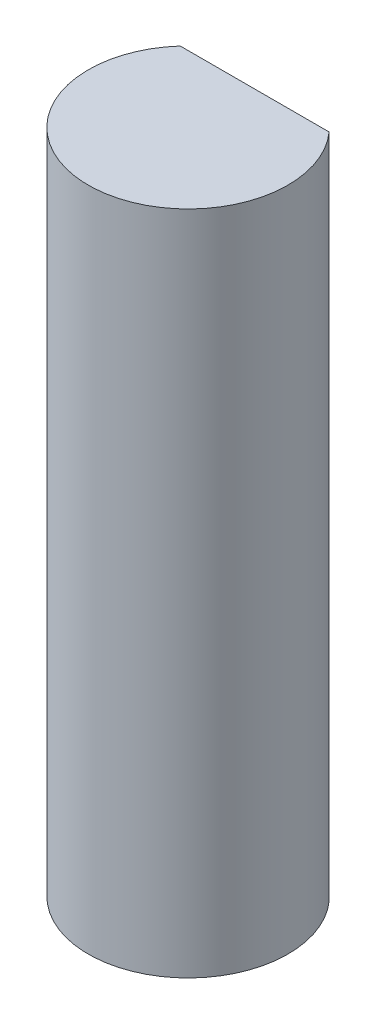
ISO-10303-21;
HEADER;
FILE_DESCRIPTION(('STEP AP214'),'2;1');
FILE_NAME('part.step','',(''),(''),'','','');
FILE_SCHEMA(('AUTOMOTIVE_DESIGN { 1 0 10303 214 1 1 1 1 }'));
ENDSEC;
DATA;
#1=APPLICATION_CONTEXT('core data for automotive mechanical design processes');
#2=APPLICATION_PROTOCOL_DEFINITION('international standard','automotive_design',2000,#1);
#3=PRODUCT_CONTEXT('',#1,'mechanical');
#4=PRODUCT('Part','Part','',(#3));
#5=PRODUCT_RELATED_PRODUCT_CATEGORY('part','',(#4));
#6=PRODUCT_DEFINITION_FORMATION('','',#4);
#7=PRODUCT_DEFINITION_CONTEXT('part definition',#1,'design');
#8=PRODUCT_DEFINITION('design','',#6,#7);
#9=PRODUCT_DEFINITION_SHAPE('','',#8);
#10=(LENGTH_UNIT() NAMED_UNIT(*) SI_UNIT(.MILLI.,.METRE.));
#11=(NAMED_UNIT(*) PLANE_ANGLE_UNIT() SI_UNIT($,.RADIAN.));
#12=(NAMED_UNIT(*) SI_UNIT($,.STERADIAN.) SOLID_ANGLE_UNIT());
#13=UNCERTAINTY_MEASURE_WITH_UNIT(LENGTH_MEASURE(1.E-05),#10,'distance_accuracy_value','');
#14=(GEOMETRIC_REPRESENTATION_CONTEXT(3) GLOBAL_UNCERTAINTY_ASSIGNED_CONTEXT((#13)) GLOBAL_UNIT_ASSIGNED_CONTEXT((#10,
#11,#12)) REPRESENTATION_CONTEXT('',''));
#15=CARTESIAN_POINT('',(0.,0.,0.));
#16=DIRECTION('',(0.,0.,1.));
#17=DIRECTION('',(1.,0.,0.));
#18=AXIS2_PLACEMENT_3D('',#15,#16,#17);
#19=CARTESIAN_POINT('',(0.,10.,-1.));
#20=DIRECTION('',(0.,0.,-1.));
#21=DIRECTION('',(-1.,0.,0.));
#22=AXIS2_PLACEMENT_3D('',#19,#20,#21);
#23=PLANE('',#22);
#24=DIRECTION('',(1.,0.,0.));
#25=VECTOR('',#24,1.);
#26=CARTESIAN_POINT('',(0.,0.,-1.));
#27=LINE('',#26,#25);
#28=CARTESIAN_POINT('',(-1.1180339887499,0.,-1.));
#29=VERTEX_POINT('',#28);
#30=CARTESIAN_POINT('',(1.1180339887499,0.,-1.));
#31=VERTEX_POINT('',#30);
#32=EDGE_CURVE('E63',#29,#31,#27,.T.);
#33=ORIENTED_EDGE('',*,*,#32,.F.);
#34=DIRECTION('',(0.,-1.,0.));
#35=VECTOR('',#34,1.);
#36=CARTESIAN_POINT('',(-1.1180339887499,10.,-1.));
#37=LINE('',#36,#35);
#38=CARTESIAN_POINT('',(-1.1180339887499,10.,-1.));
#39=VERTEX_POINT('',#38);
#40=EDGE_CURVE('E11',#39,#29,#37,.T.);
#41=ORIENTED_EDGE('',*,*,#40,.F.);
#42=DIRECTION('',(1.,0.,0.));
#43=VECTOR('',#42,1.);
#44=CARTESIAN_POINT('',(0.,10.,-1.));
#45=LINE('',#44,#43);
#46=CARTESIAN_POINT('',(1.1180339887499,10.,-1.));
#47=VERTEX_POINT('',#46);
#48=EDGE_CURVE('E64',#39,#47,#45,.T.);
#49=ORIENTED_EDGE('',*,*,#48,.T.);
#50=DIRECTION('',(0.,-1.,0.));
#51=VECTOR('',#50,1.);
#52=CARTESIAN_POINT('',(1.1180339887499,10.,-1.));
#53=LINE('',#52,#51);
#54=EDGE_CURVE('E43',#47,#31,#53,.T.);
#55=ORIENTED_EDGE('',*,*,#54,.T.);
#56=EDGE_LOOP('',(#33,#41,#49,#55));
#57=FACE_BOUND('',#56,.T.);
#58=ADVANCED_FACE('F35',(#57),#23,.T.);
#59=CARTESIAN_POINT('',(0.,10.,0.));
#60=DIRECTION('',(0.,-1.,0.));
#61=DIRECTION('',(0.,0.,-1.));
#62=AXIS2_PLACEMENT_3D('',#59,#60,#61);
#63=CYLINDRICAL_SURFACE('',#62,1.5);
#64=CARTESIAN_POINT('',(0.,0.,0.));
#65=DIRECTION('',(0.,1.,0.));
#66=DIRECTION('',(0.,0.,1.));
#67=AXIS2_PLACEMENT_3D('',#64,#65,#66);
#68=CIRCLE('',#67,1.5);
#69=EDGE_CURVE('E65',#29,#31,#68,.T.);
#70=ORIENTED_EDGE('',*,*,#69,.T.);
#71=ORIENTED_EDGE('',*,*,#54,.F.);
#72=CARTESIAN_POINT('',(0.,10.,0.));
#73=DIRECTION('',(0.,1.,0.));
#74=DIRECTION('',(0.,0.,1.));
#75=AXIS2_PLACEMENT_3D('',#72,#73,#74);
#76=CIRCLE('',#75,1.5);
#77=EDGE_CURVE('E50',#39,#47,#76,.T.);
#78=ORIENTED_EDGE('',*,*,#77,.F.);
#79=ORIENTED_EDGE('',*,*,#40,.T.);
#80=EDGE_LOOP('',(#70,#71,#78,#79));
#81=FACE_BOUND('',#80,.T.);
#82=ADVANCED_FACE('F66',(#81),#63,.T.);
#83=CARTESIAN_POINT('',(0.,10.,0.));
#84=DIRECTION('',(0.,1.,0.));
#85=DIRECTION('',(0.,0.,1.));
#86=AXIS2_PLACEMENT_3D('',#83,#84,#85);
#87=PLANE('',#86);
#88=ORIENTED_EDGE('',*,*,#48,.F.);
#89=ORIENTED_EDGE('',*,*,#77,.T.);
#90=EDGE_LOOP('',(#88,#89));
#91=FACE_BOUND('',#90,.T.);
#92=ADVANCED_FACE('F74',(#91),#87,.T.);
#93=CARTESIAN_POINT('',(0.,0.,0.));
#94=DIRECTION('',(0.,1.,0.));
#95=DIRECTION('',(0.,0.,1.));
#96=AXIS2_PLACEMENT_3D('',#93,#94,#95);
#97=PLANE('',#96);
#98=ORIENTED_EDGE('',*,*,#32,.T.);
#99=ORIENTED_EDGE('',*,*,#69,.F.);
#100=EDGE_LOOP('',(#98,#99));
#101=FACE_BOUND('',#100,.T.);
#102=ADVANCED_FACE('F69',(#101),#97,.F.);
#103=CLOSED_SHELL('',(#58,#82,#92,#102));
#104=MANIFOLD_SOLID_BREP('B2',#103);
#105=ADVANCED_BREP_SHAPE_REPRESENTATION('',(#18,#104),#14);
#106=SHAPE_DEFINITION_REPRESENTATION(#9,#105);
ENDSEC;
END-ISO-10303-21;
